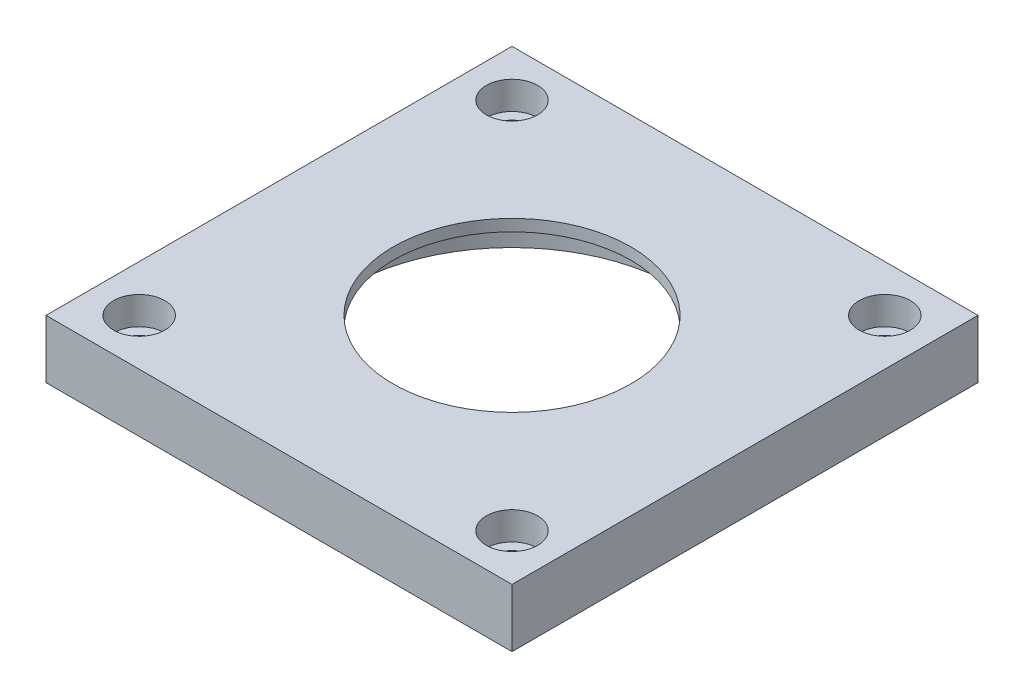
ISO-10303-21;
HEADER;
FILE_DESCRIPTION(('STEP AP214'),'2;1');
FILE_NAME('part.step','',(''),(''),'','','');
FILE_SCHEMA(('AUTOMOTIVE_DESIGN { 1 0 10303 214 1 1 1 1 }'));
ENDSEC;
DATA;
#1=APPLICATION_CONTEXT('core data for automotive mechanical design processes');
#2=APPLICATION_PROTOCOL_DEFINITION('international standard','automotive_design',2000,#1);
#3=PRODUCT_CONTEXT('',#1,'mechanical');
#4=PRODUCT('Part','Part','',(#3));
#5=PRODUCT_RELATED_PRODUCT_CATEGORY('part','',(#4));
#6=PRODUCT_DEFINITION_FORMATION('','',#4);
#7=PRODUCT_DEFINITION_CONTEXT('part definition',#1,'design');
#8=PRODUCT_DEFINITION('design','',#6,#7);
#9=PRODUCT_DEFINITION_SHAPE('','',#8);
#10=(LENGTH_UNIT() NAMED_UNIT(*) SI_UNIT(.MILLI.,.METRE.));
#11=(NAMED_UNIT(*) PLANE_ANGLE_UNIT() SI_UNIT($,.RADIAN.));
#12=(NAMED_UNIT(*) SI_UNIT($,.STERADIAN.) SOLID_ANGLE_UNIT());
#13=UNCERTAINTY_MEASURE_WITH_UNIT(LENGTH_MEASURE(1.E-05),#10,'distance_accuracy_value','');
#14=(GEOMETRIC_REPRESENTATION_CONTEXT(3) GLOBAL_UNCERTAINTY_ASSIGNED_CONTEXT((#13)) GLOBAL_UNIT_ASSIGNED_CONTEXT((#10,
#11,#12)) REPRESENTATION_CONTEXT('',''));
#15=CARTESIAN_POINT('',(0.,0.,0.));
#16=DIRECTION('',(0.,0.,1.));
#17=DIRECTION('',(1.,0.,0.));
#18=AXIS2_PLACEMENT_3D('',#15,#16,#17);
#19=CARTESIAN_POINT('',(-40.,12.5,40.));
#20=DIRECTION('',(0.,-1.,0.));
#21=DIRECTION('',(0.,0.,-1.));
#22=AXIS2_PLACEMENT_3D('',#19,#20,#21);
#23=CYLINDRICAL_SURFACE('',#22,3.25);
#24=CARTESIAN_POINT('',(-40.,0.,40.));
#25=DIRECTION('',(0.,-1.,0.));
#26=DIRECTION('',(0.,0.,-1.));
#27=AXIS2_PLACEMENT_3D('',#24,#25,#26);
#28=CIRCLE('',#27,3.25);
#29=CARTESIAN_POINT('',(-40.,0.,36.75));
#30=VERTEX_POINT('',#29);
#31=EDGE_CURVE('E139',#30,#30,#28,.T.);
#32=ORIENTED_EDGE('',*,*,#31,.T.);
#33=EDGE_LOOP('',(#32));
#34=FACE_BOUND('',#33,.T.);
#35=CARTESIAN_POINT('',(-40.,6.5,40.));
#36=DIRECTION('',(0.,1.,0.));
#37=DIRECTION('',(0.,0.,1.));
#38=AXIS2_PLACEMENT_3D('',#35,#36,#37);
#39=CIRCLE('',#38,3.25);
#40=CARTESIAN_POINT('',(-40.,6.5,43.25));
#41=VERTEX_POINT('',#40);
#42=EDGE_CURVE('E40',#41,#41,#39,.F.);
#43=ORIENTED_EDGE('',*,*,#42,.F.);
#44=EDGE_LOOP('',(#43));
#45=FACE_BOUND('',#44,.T.);
#46=ADVANCED_FACE('F36',(#34,#45),#23,.F.);
#47=CARTESIAN_POINT('',(39.9999999999996,12.5,40.0000000000004));
#48=DIRECTION('',(0.,-1.,0.));
#49=DIRECTION('',(0.,0.,-1.));
#50=AXIS2_PLACEMENT_3D('',#47,#48,#49);
#51=CYLINDRICAL_SURFACE('',#50,3.25);
#52=CARTESIAN_POINT('',(39.9999999999996,0.,40.0000000000004));
#53=DIRECTION('',(0.,-1.,0.));
#54=DIRECTION('',(-1.,0.,0.));
#55=AXIS2_PLACEMENT_3D('',#52,#53,#54);
#56=CIRCLE('',#55,3.25);
#57=CARTESIAN_POINT('',(36.7499999999996,0.,40.0000000000004));
#58=VERTEX_POINT('',#57);
#59=EDGE_CURVE('E115',#58,#58,#56,.T.);
#60=ORIENTED_EDGE('',*,*,#59,.T.);
#61=EDGE_LOOP('',(#60));
#62=FACE_BOUND('',#61,.T.);
#63=CARTESIAN_POINT('',(39.9999999999996,6.5,40.0000000000004));
#64=DIRECTION('',(0.,1.,0.));
#65=DIRECTION('',(0.,0.,1.));
#66=AXIS2_PLACEMENT_3D('',#63,#64,#65);
#67=CIRCLE('',#66,3.25);
#68=CARTESIAN_POINT('',(39.9999999999996,6.5,43.2500000000004));
#69=VERTEX_POINT('',#68);
#70=EDGE_CURVE('E119',#69,#69,#67,.F.);
#71=ORIENTED_EDGE('',*,*,#70,.F.);
#72=EDGE_LOOP('',(#71));
#73=FACE_BOUND('',#72,.T.);
#74=ADVANCED_FACE('F179',(#62,#73),#51,.F.);
#75=CARTESIAN_POINT('',(40.,12.5,-40.));
#76=DIRECTION('',(0.,-1.,0.));
#77=DIRECTION('',(0.,0.,-1.));
#78=AXIS2_PLACEMENT_3D('',#75,#76,#77);
#79=CYLINDRICAL_SURFACE('',#78,3.25);
#80=CARTESIAN_POINT('',(40.,0.,-40.));
#81=DIRECTION('',(0.,-1.,0.));
#82=DIRECTION('',(0.,0.,1.));
#83=AXIS2_PLACEMENT_3D('',#80,#81,#82);
#84=CIRCLE('',#83,3.25);
#85=CARTESIAN_POINT('',(40.,0.,-36.75));
#86=VERTEX_POINT('',#85);
#87=EDGE_CURVE('E140',#86,#86,#84,.T.);
#88=ORIENTED_EDGE('',*,*,#87,.T.);
#89=EDGE_LOOP('',(#88));
#90=FACE_BOUND('',#89,.T.);
#91=CARTESIAN_POINT('',(40.,6.5,-40.));
#92=DIRECTION('',(0.,1.,0.));
#93=DIRECTION('',(0.,0.,1.));
#94=AXIS2_PLACEMENT_3D('',#91,#92,#93);
#95=CIRCLE('',#94,3.25);
#96=CARTESIAN_POINT('',(40.,6.5,-36.75));
#97=VERTEX_POINT('',#96);
#98=EDGE_CURVE('E117',#97,#97,#95,.F.);
#99=ORIENTED_EDGE('',*,*,#98,.F.);
#100=EDGE_LOOP('',(#99));
#101=FACE_BOUND('',#100,.T.);
#102=ADVANCED_FACE('F185',(#90,#101),#79,.F.);
#103=CARTESIAN_POINT('',(-39.9999999999999,12.5,-40.0000000000001));
#104=DIRECTION('',(0.,-1.,0.));
#105=DIRECTION('',(0.,0.,-1.));
#106=AXIS2_PLACEMENT_3D('',#103,#104,#105);
#107=CYLINDRICAL_SURFACE('',#106,3.25);
#108=CARTESIAN_POINT('',(-39.9999999999999,0.,-40.0000000000001));
#109=DIRECTION('',(0.,-1.,0.));
#110=DIRECTION('',(1.,0.,0.));
#111=AXIS2_PLACEMENT_3D('',#108,#109,#110);
#112=CIRCLE('',#111,3.25);
#113=CARTESIAN_POINT('',(-36.7499999999999,0.,-40.0000000000001));
#114=VERTEX_POINT('',#113);
#115=EDGE_CURVE('E136',#114,#114,#112,.T.);
#116=ORIENTED_EDGE('',*,*,#115,.T.);
#117=EDGE_LOOP('',(#116));
#118=FACE_BOUND('',#117,.T.);
#119=CARTESIAN_POINT('',(-39.9999999999999,6.5,-40.0000000000001));
#120=DIRECTION('',(0.,1.,0.));
#121=DIRECTION('',(0.,0.,1.));
#122=AXIS2_PLACEMENT_3D('',#119,#120,#121);
#123=CIRCLE('',#122,3.25);
#124=CARTESIAN_POINT('',(-39.9999999999999,6.5,-36.7500000000001));
#125=VERTEX_POINT('',#124);
#126=EDGE_CURVE('E112',#125,#125,#123,.F.);
#127=ORIENTED_EDGE('',*,*,#126,.F.);
#128=EDGE_LOOP('',(#127));
#129=FACE_BOUND('',#128,.T.);
#130=ADVANCED_FACE('F323',(#118,#129),#107,.F.);
#131=CARTESIAN_POINT('',(50.,12.5,-50.));
#132=DIRECTION('',(-1.,0.,0.));
#133=DIRECTION('',(0.,0.,1.));
#134=AXIS2_PLACEMENT_3D('',#131,#132,#133);
#135=PLANE('',#134);
#136=DIRECTION('',(0.,0.,-1.));
#137=VECTOR('',#136,1.);
#138=CARTESIAN_POINT('',(50.,0.,-50.));
#139=LINE('',#138,#137);
#140=CARTESIAN_POINT('',(50.,0.,50.));
#141=VERTEX_POINT('',#140);
#142=CARTESIAN_POINT('',(50.,0.,-50.));
#143=VERTEX_POINT('',#142);
#144=EDGE_CURVE('E103',#141,#143,#139,.T.);
#145=ORIENTED_EDGE('',*,*,#144,.T.);
#146=DIRECTION('',(0.,-1.,0.));
#147=VECTOR('',#146,1.);
#148=CARTESIAN_POINT('',(50.,12.5,-50.));
#149=LINE('',#148,#147);
#150=CARTESIAN_POINT('',(50.,12.5,-50.));
#151=VERTEX_POINT('',#150);
#152=EDGE_CURVE('E11',#151,#143,#149,.T.);
#153=ORIENTED_EDGE('',*,*,#152,.F.);
#154=DIRECTION('',(0.,0.,-1.));
#155=VECTOR('',#154,1.);
#156=CARTESIAN_POINT('',(50.,12.5,-50.));
#157=LINE('',#156,#155);
#158=CARTESIAN_POINT('',(50.,12.5,50.));
#159=VERTEX_POINT('',#158);
#160=EDGE_CURVE('E90',#159,#151,#157,.T.);
#161=ORIENTED_EDGE('',*,*,#160,.F.);
#162=DIRECTION('',(0.,-1.,0.));
#163=VECTOR('',#162,1.);
#164=CARTESIAN_POINT('',(50.,12.5,50.));
#165=LINE('',#164,#163);
#166=EDGE_CURVE('E99',#159,#141,#165,.T.);
#167=ORIENTED_EDGE('',*,*,#166,.T.);
#168=EDGE_LOOP('',(#145,#153,#161,#167));
#169=FACE_BOUND('',#168,.T.);
#170=ADVANCED_FACE('F38',(#169),#135,.F.);
#171=CARTESIAN_POINT('',(-50.,12.5,-50.));
#172=DIRECTION('',(0.,0.,1.));
#173=DIRECTION('',(1.,0.,0.));
#174=AXIS2_PLACEMENT_3D('',#171,#172,#173);
#175=PLANE('',#174);
#176=DIRECTION('',(-1.,0.,0.));
#177=VECTOR('',#176,1.);
#178=CARTESIAN_POINT('',(-50.,0.,-50.));
#179=LINE('',#178,#177);
#180=CARTESIAN_POINT('',(-50.,0.,-50.));
#181=VERTEX_POINT('',#180);
#182=EDGE_CURVE('E94',#143,#181,#179,.T.);
#183=ORIENTED_EDGE('',*,*,#182,.T.);
#184=DIRECTION('',(0.,-1.,0.));
#185=VECTOR('',#184,1.);
#186=CARTESIAN_POINT('',(-50.,12.5,-50.));
#187=LINE('',#186,#185);
#188=CARTESIAN_POINT('',(-50.,12.5,-50.));
#189=VERTEX_POINT('',#188);
#190=EDGE_CURVE('E46',#189,#181,#187,.T.);
#191=ORIENTED_EDGE('',*,*,#190,.F.);
#192=DIRECTION('',(-1.,0.,0.));
#193=VECTOR('',#192,1.);
#194=CARTESIAN_POINT('',(-50.,12.5,-50.));
#195=LINE('',#194,#193);
#196=EDGE_CURVE('E85',#151,#189,#195,.T.);
#197=ORIENTED_EDGE('',*,*,#196,.F.);
#198=ORIENTED_EDGE('',*,*,#152,.T.);
#199=EDGE_LOOP('',(#183,#191,#197,#198));
#200=FACE_BOUND('',#199,.T.);
#201=ADVANCED_FACE('F93',(#200),#175,.F.);
#202=CARTESIAN_POINT('',(-50.,12.5,-50.));
#203=DIRECTION('',(1.,0.,0.));
#204=DIRECTION('',(0.,0.,-1.));
#205=AXIS2_PLACEMENT_3D('',#202,#203,#204);
#206=PLANE('',#205);
#207=DIRECTION('',(0.,0.,1.));
#208=VECTOR('',#207,1.);
#209=CARTESIAN_POINT('',(-50.,0.,-50.));
#210=LINE('',#209,#208);
#211=CARTESIAN_POINT('',(-50.,0.,50.));
#212=VERTEX_POINT('',#211);
#213=EDGE_CURVE('E72',#181,#212,#210,.T.);
#214=ORIENTED_EDGE('',*,*,#213,.T.);
#215=DIRECTION('',(0.,-1.,0.));
#216=VECTOR('',#215,1.);
#217=CARTESIAN_POINT('',(-50.,12.5,50.));
#218=LINE('',#217,#216);
#219=CARTESIAN_POINT('',(-50.,12.5,50.));
#220=VERTEX_POINT('',#219);
#221=EDGE_CURVE('E95',#220,#212,#218,.T.);
#222=ORIENTED_EDGE('',*,*,#221,.F.);
#223=DIRECTION('',(0.,0.,1.));
#224=VECTOR('',#223,1.);
#225=CARTESIAN_POINT('',(-50.,12.5,-50.));
#226=LINE('',#225,#224);
#227=EDGE_CURVE('E88',#189,#220,#226,.T.);
#228=ORIENTED_EDGE('',*,*,#227,.F.);
#229=ORIENTED_EDGE('',*,*,#190,.T.);
#230=EDGE_LOOP('',(#214,#222,#228,#229));
#231=FACE_BOUND('',#230,.T.);
#232=ADVANCED_FACE('F97',(#231),#206,.F.);
#233=CARTESIAN_POINT('',(-50.,12.5,50.));
#234=DIRECTION('',(0.,0.,-1.));
#235=DIRECTION('',(-1.,0.,0.));
#236=AXIS2_PLACEMENT_3D('',#233,#234,#235);
#237=PLANE('',#236);
#238=DIRECTION('',(1.,0.,0.));
#239=VECTOR('',#238,1.);
#240=CARTESIAN_POINT('',(-50.,0.,50.));
#241=LINE('',#240,#239);
#242=EDGE_CURVE('E78',#212,#141,#241,.T.);
#243=ORIENTED_EDGE('',*,*,#242,.T.);
#244=ORIENTED_EDGE('',*,*,#166,.F.);
#245=DIRECTION('',(1.,0.,0.));
#246=VECTOR('',#245,1.);
#247=CARTESIAN_POINT('',(-50.,12.5,50.));
#248=LINE('',#247,#246);
#249=EDGE_CURVE('E55',#220,#159,#248,.T.);
#250=ORIENTED_EDGE('',*,*,#249,.F.);
#251=ORIENTED_EDGE('',*,*,#221,.T.);
#252=EDGE_LOOP('',(#243,#244,#250,#251));
#253=FACE_BOUND('',#252,.T.);
#254=ADVANCED_FACE('F168',(#253),#237,.F.);
#255=CARTESIAN_POINT('',(0.,12.5,0.));
#256=DIRECTION('',(0.,1.,0.));
#257=DIRECTION('',(0.,0.,1.));
#258=AXIS2_PLACEMENT_3D('',#255,#256,#257);
#259=PLANE('',#258);
#260=CARTESIAN_POINT('',(40.0000000000003,12.5,-39.9999999999997));
#261=DIRECTION('',(0.,1.,0.));
#262=DIRECTION('',(-1.,0.,0.));
#263=AXIS2_PLACEMENT_3D('',#260,#261,#262);
#264=CIRCLE('',#263,5.5);
#265=CARTESIAN_POINT('',(34.5000000000003,12.5,-39.9999999999997));
#266=VERTEX_POINT('',#265);
#267=EDGE_CURVE('E437',#266,#266,#264,.T.);
#268=ORIENTED_EDGE('',*,*,#267,.F.);
#269=EDGE_LOOP('',(#268));
#270=FACE_BOUND('',#269,.T.);
#271=CARTESIAN_POINT('',(39.9999999999999,12.5,40.0000000000001));
#272=DIRECTION('',(0.,1.,0.));
#273=DIRECTION('',(0.,0.,-1.));
#274=AXIS2_PLACEMENT_3D('',#271,#272,#273);
#275=CIRCLE('',#274,5.5);
#276=CARTESIAN_POINT('',(39.9999999999999,12.5,34.5000000000001));
#277=VERTEX_POINT('',#276);
#278=EDGE_CURVE('E429',#277,#277,#275,.T.);
#279=ORIENTED_EDGE('',*,*,#278,.F.);
#280=EDGE_LOOP('',(#279));
#281=FACE_BOUND('',#280,.T.);
#282=CARTESIAN_POINT('',(-40.0000000000006,12.5,39.9999999999994));
#283=DIRECTION('',(0.,1.,0.));
#284=DIRECTION('',(1.,0.,0.));
#285=AXIS2_PLACEMENT_3D('',#282,#283,#284);
#286=CIRCLE('',#285,5.5);
#287=CARTESIAN_POINT('',(-34.5000000000006,12.5,39.9999999999995));
#288=VERTEX_POINT('',#287);
#289=EDGE_CURVE('E427',#288,#288,#286,.T.);
#290=ORIENTED_EDGE('',*,*,#289,.F.);
#291=EDGE_LOOP('',(#290));
#292=FACE_BOUND('',#291,.T.);
#293=CARTESIAN_POINT('',(-39.9999999999999,12.5,-40.0000000000001));
#294=DIRECTION('',(0.,1.,0.));
#295=DIRECTION('',(0.,0.,1.));
#296=AXIS2_PLACEMENT_3D('',#293,#294,#295);
#297=CIRCLE('',#296,5.5);
#298=CARTESIAN_POINT('',(-39.9999999999999,12.5,-34.5000000000001));
#299=VERTEX_POINT('',#298);
#300=EDGE_CURVE('E125',#299,#299,#297,.T.);
#301=ORIENTED_EDGE('',*,*,#300,.F.);
#302=EDGE_LOOP('',(#301));
#303=FACE_BOUND('',#302,.T.);
#304=CARTESIAN_POINT('',(0.,12.5,0.));
#305=DIRECTION('',(0.,-1.,0.));
#306=DIRECTION('',(0.,0.,-1.));
#307=AXIS2_PLACEMENT_3D('',#304,#305,#306);
#308=CIRCLE('',#307,25.5);
#309=CARTESIAN_POINT('',(0.,12.5,-25.5));
#310=VERTEX_POINT('',#309);
#311=EDGE_CURVE('E148',#310,#310,#308,.T.);
#312=ORIENTED_EDGE('',*,*,#311,.T.);
#313=EDGE_LOOP('',(#312));
#314=FACE_BOUND('',#313,.T.);
#315=ORIENTED_EDGE('',*,*,#160,.T.);
#316=ORIENTED_EDGE('',*,*,#196,.T.);
#317=ORIENTED_EDGE('',*,*,#227,.T.);
#318=ORIENTED_EDGE('',*,*,#249,.T.);
#319=EDGE_LOOP('',(#315,#316,#317,#318));
#320=FACE_BOUND('',#319,.T.);
#321=ADVANCED_FACE('F86',(#270,#281,#292,#303,#314,#320),#259,.T.);
#322=CARTESIAN_POINT('',(0.,0.,0.));
#323=DIRECTION('',(0.,1.,0.));
#324=DIRECTION('',(0.,0.,1.));
#325=AXIS2_PLACEMENT_3D('',#322,#323,#324);
#326=PLANE('',#325);
#327=ORIENTED_EDGE('',*,*,#115,.F.);
#328=EDGE_LOOP('',(#327));
#329=FACE_BOUND('',#328,.T.);
#330=ORIENTED_EDGE('',*,*,#87,.F.);
#331=EDGE_LOOP('',(#330));
#332=FACE_BOUND('',#331,.T.);
#333=ORIENTED_EDGE('',*,*,#59,.F.);
#334=EDGE_LOOP('',(#333));
#335=FACE_BOUND('',#334,.T.);
#336=ORIENTED_EDGE('',*,*,#31,.F.);
#337=EDGE_LOOP('',(#336));
#338=FACE_BOUND('',#337,.T.);
#339=CARTESIAN_POINT('',(0.,0.,0.));
#340=DIRECTION('',(0.,-1.,0.));
#341=DIRECTION('',(0.,0.,-1.));
#342=AXIS2_PLACEMENT_3D('',#339,#340,#341);
#343=CIRCLE('',#342,35.5);
#344=CARTESIAN_POINT('',(0.,0.,-35.5));
#345=VERTEX_POINT('',#344);
#346=EDGE_CURVE('E151',#345,#345,#343,.T.);
#347=ORIENTED_EDGE('',*,*,#346,.F.);
#348=EDGE_LOOP('',(#347));
#349=FACE_BOUND('',#348,.T.);
#350=ORIENTED_EDGE('',*,*,#144,.F.);
#351=ORIENTED_EDGE('',*,*,#242,.F.);
#352=ORIENTED_EDGE('',*,*,#213,.F.);
#353=ORIENTED_EDGE('',*,*,#182,.F.);
#354=EDGE_LOOP('',(#350,#351,#352,#353));
#355=FACE_BOUND('',#354,.T.);
#356=ADVANCED_FACE('F161',(#329,#332,#335,#338,#349,#355),#326,.F.);
#357=CARTESIAN_POINT('',(0.,10.,0.));
#358=DIRECTION('',(0.,-1.,0.));
#359=DIRECTION('',(0.,0.,-1.));
#360=AXIS2_PLACEMENT_3D('',#357,#358,#359);
#361=CYLINDRICAL_SURFACE('',#360,35.5);
#362=CARTESIAN_POINT('',(0.,10.,0.));
#363=DIRECTION('',(0.,-1.,0.));
#364=DIRECTION('',(0.,0.,-1.));
#365=AXIS2_PLACEMENT_3D('',#362,#363,#364);
#366=CIRCLE('',#365,35.5);
#367=CARTESIAN_POINT('',(0.,10.,-35.5));
#368=VERTEX_POINT('',#367);
#369=EDGE_CURVE('E106',#368,#368,#366,.T.);
#370=ORIENTED_EDGE('',*,*,#369,.F.);
#371=EDGE_LOOP('',(#370));
#372=FACE_BOUND('',#371,.T.);
#373=ORIENTED_EDGE('',*,*,#346,.T.);
#374=EDGE_LOOP('',(#373));
#375=FACE_BOUND('',#374,.T.);
#376=ADVANCED_FACE('F159',(#372,#375),#361,.F.);
#377=CARTESIAN_POINT('',(0.,10.,0.));
#378=DIRECTION('',(0.,-1.,0.));
#379=DIRECTION('',(0.,0.,-1.));
#380=AXIS2_PLACEMENT_3D('',#377,#378,#379);
#381=PLANE('',#380);
#382=CARTESIAN_POINT('',(0.,10.,0.));
#383=DIRECTION('',(0.,-1.,0.));
#384=DIRECTION('',(0.,0.,-1.));
#385=AXIS2_PLACEMENT_3D('',#382,#383,#384);
#386=CIRCLE('',#385,25.5);
#387=CARTESIAN_POINT('',(0.,10.,-25.5));
#388=VERTEX_POINT('',#387);
#389=EDGE_CURVE('E147',#388,#388,#386,.T.);
#390=ORIENTED_EDGE('',*,*,#389,.F.);
#391=EDGE_LOOP('',(#390));
#392=FACE_BOUND('',#391,.T.);
#393=ORIENTED_EDGE('',*,*,#369,.T.);
#394=EDGE_LOOP('',(#393));
#395=FACE_BOUND('',#394,.T.);
#396=ADVANCED_FACE('F195',(#392,#395),#381,.T.);
#397=CARTESIAN_POINT('',(0.,12.5,0.));
#398=DIRECTION('',(0.,-1.,0.));
#399=DIRECTION('',(0.,0.,-1.));
#400=AXIS2_PLACEMENT_3D('',#397,#398,#399);
#401=CYLINDRICAL_SURFACE('',#400,25.5);
#402=ORIENTED_EDGE('',*,*,#311,.F.);
#403=EDGE_LOOP('',(#402));
#404=FACE_BOUND('',#403,.T.);
#405=ORIENTED_EDGE('',*,*,#389,.T.);
#406=EDGE_LOOP('',(#405));
#407=FACE_BOUND('',#406,.T.);
#408=ADVANCED_FACE('F191',(#404,#407),#401,.F.);
#409=CARTESIAN_POINT('',(-39.9999999999999,6.5,-40.0000000000001));
#410=DIRECTION('',(0.,1.,0.));
#411=DIRECTION('',(0.,0.,1.));
#412=AXIS2_PLACEMENT_3D('',#409,#410,#411);
#413=PLANE('',#412);
#414=CARTESIAN_POINT('',(-39.9999999999999,6.5,-40.0000000000001));
#415=DIRECTION('',(0.,1.,0.));
#416=DIRECTION('',(0.,0.,1.));
#417=AXIS2_PLACEMENT_3D('',#414,#415,#416);
#418=CIRCLE('',#417,5.5);
#419=CARTESIAN_POINT('',(-39.9999999999999,6.5,-34.5000000000001));
#420=VERTEX_POINT('',#419);
#421=EDGE_CURVE('E116',#420,#420,#418,.T.);
#422=ORIENTED_EDGE('',*,*,#421,.T.);
#423=EDGE_LOOP('',(#422));
#424=FACE_BOUND('',#423,.T.);
#425=ORIENTED_EDGE('',*,*,#126,.T.);
#426=EDGE_LOOP('',(#425));
#427=FACE_BOUND('',#426,.T.);
#428=ADVANCED_FACE('F194',(#424,#427),#413,.T.);
#429=CARTESIAN_POINT('',(-39.9999999999999,6.5,-40.0000000000001));
#430=DIRECTION('',(0.,1.,0.));
#431=DIRECTION('',(0.,0.,1.));
#432=AXIS2_PLACEMENT_3D('',#429,#430,#431);
#433=CYLINDRICAL_SURFACE('',#432,5.5);
#434=ORIENTED_EDGE('',*,*,#421,.F.);
#435=EDGE_LOOP('',(#434));
#436=FACE_BOUND('',#435,.T.);
#437=ORIENTED_EDGE('',*,*,#300,.T.);
#438=EDGE_LOOP('',(#437));
#439=FACE_BOUND('',#438,.T.);
#440=ADVANCED_FACE('F222',(#436,#439),#433,.F.);
#441=CARTESIAN_POINT('',(40.0000000000003,6.5,-39.9999999999997));
#442=DIRECTION('',(0.,1.,0.));
#443=DIRECTION('',(-1.,0.,0.));
#444=AXIS2_PLACEMENT_3D('',#441,#442,#443);
#445=PLANE('',#444);
#446=CARTESIAN_POINT('',(40.0000000000003,6.5,-39.9999999999997));
#447=DIRECTION('',(0.,1.,0.));
#448=DIRECTION('',(-1.,0.,0.));
#449=AXIS2_PLACEMENT_3D('',#446,#447,#448);
#450=CIRCLE('',#449,5.5);
#451=CARTESIAN_POINT('',(34.5000000000003,6.5,-39.9999999999997));
#452=VERTEX_POINT('',#451);
#453=EDGE_CURVE('E120',#452,#452,#450,.T.);
#454=ORIENTED_EDGE('',*,*,#453,.T.);
#455=EDGE_LOOP('',(#454));
#456=FACE_BOUND('',#455,.T.);
#457=ORIENTED_EDGE('',*,*,#98,.T.);
#458=EDGE_LOOP('',(#457));
#459=FACE_BOUND('',#458,.T.);
#460=ADVANCED_FACE('F231',(#456,#459),#445,.T.);
#461=CARTESIAN_POINT('',(40.0000000000003,6.5,-39.9999999999997));
#462=DIRECTION('',(0.,1.,0.));
#463=DIRECTION('',(0.,0.,1.));
#464=AXIS2_PLACEMENT_3D('',#461,#462,#463);
#465=CYLINDRICAL_SURFACE('',#464,5.5);
#466=ORIENTED_EDGE('',*,*,#453,.F.);
#467=EDGE_LOOP('',(#466));
#468=FACE_BOUND('',#467,.T.);
#469=ORIENTED_EDGE('',*,*,#267,.T.);
#470=EDGE_LOOP('',(#469));
#471=FACE_BOUND('',#470,.T.);
#472=ADVANCED_FACE('F239',(#468,#471),#465,.F.);
#473=CARTESIAN_POINT('',(39.9999999999999,6.5,40.0000000000001));
#474=DIRECTION('',(0.,1.,0.));
#475=DIRECTION('',(0.,0.,-1.));
#476=AXIS2_PLACEMENT_3D('',#473,#474,#475);
#477=PLANE('',#476);
#478=CARTESIAN_POINT('',(39.9999999999999,6.5,40.0000000000001));
#479=DIRECTION('',(0.,1.,0.));
#480=DIRECTION('',(0.,0.,-1.));
#481=AXIS2_PLACEMENT_3D('',#478,#479,#480);
#482=CIRCLE('',#481,5.5);
#483=CARTESIAN_POINT('',(39.9999999999999,6.5,34.5000000000001));
#484=VERTEX_POINT('',#483);
#485=EDGE_CURVE('E434',#484,#484,#482,.T.);
#486=ORIENTED_EDGE('',*,*,#485,.T.);
#487=EDGE_LOOP('',(#486));
#488=FACE_BOUND('',#487,.T.);
#489=ORIENTED_EDGE('',*,*,#70,.T.);
#490=EDGE_LOOP('',(#489));
#491=FACE_BOUND('',#490,.T.);
#492=ADVANCED_FACE('F248',(#488,#491),#477,.T.);
#493=CARTESIAN_POINT('',(39.9999999999999,6.5,40.0000000000001));
#494=DIRECTION('',(0.,1.,0.));
#495=DIRECTION('',(0.,0.,1.));
#496=AXIS2_PLACEMENT_3D('',#493,#494,#495);
#497=CYLINDRICAL_SURFACE('',#496,5.5);
#498=ORIENTED_EDGE('',*,*,#485,.F.);
#499=EDGE_LOOP('',(#498));
#500=FACE_BOUND('',#499,.T.);
#501=ORIENTED_EDGE('',*,*,#278,.T.);
#502=EDGE_LOOP('',(#501));
#503=FACE_BOUND('',#502,.T.);
#504=ADVANCED_FACE('F256',(#500,#503),#497,.F.);
#505=CARTESIAN_POINT('',(-40.0000000000006,6.5,39.9999999999994));
#506=DIRECTION('',(0.,1.,0.));
#507=DIRECTION('',(1.,0.,0.));
#508=AXIS2_PLACEMENT_3D('',#505,#506,#507);
#509=PLANE('',#508);
#510=CARTESIAN_POINT('',(-40.0000000000006,6.5,39.9999999999994));
#511=DIRECTION('',(0.,1.,0.));
#512=DIRECTION('',(1.,0.,0.));
#513=AXIS2_PLACEMENT_3D('',#510,#511,#512);
#514=CIRCLE('',#513,5.5);
#515=CARTESIAN_POINT('',(-34.5000000000006,6.5,39.9999999999995));
#516=VERTEX_POINT('',#515);
#517=EDGE_CURVE('E424',#516,#516,#514,.T.);
#518=ORIENTED_EDGE('',*,*,#517,.T.);
#519=EDGE_LOOP('',(#518));
#520=FACE_BOUND('',#519,.T.);
#521=ORIENTED_EDGE('',*,*,#42,.T.);
#522=EDGE_LOOP('',(#521));
#523=FACE_BOUND('',#522,.T.);
#524=ADVANCED_FACE('F264',(#520,#523),#509,.T.);
#525=CARTESIAN_POINT('',(-40.0000000000006,6.5,39.9999999999994));
#526=DIRECTION('',(0.,1.,0.));
#527=DIRECTION('',(0.,0.,1.));
#528=AXIS2_PLACEMENT_3D('',#525,#526,#527);
#529=CYLINDRICAL_SURFACE('',#528,5.5);
#530=ORIENTED_EDGE('',*,*,#517,.F.);
#531=EDGE_LOOP('',(#530));
#532=FACE_BOUND('',#531,.T.);
#533=ORIENTED_EDGE('',*,*,#289,.T.);
#534=EDGE_LOOP('',(#533));
#535=FACE_BOUND('',#534,.T.);
#536=ADVANCED_FACE('F272',(#532,#535),#529,.F.);
#537=CLOSED_SHELL('',(#46,#74,#102,#130,#170,#201,#232,#254,#321,#356,#376,#396,#408,#428,#440,
#460,#472,#492,#504,#524,#536));
#538=MANIFOLD_SOLID_BREP('B2',#537);
#539=ADVANCED_BREP_SHAPE_REPRESENTATION('',(#18,#538),#14);
#540=SHAPE_DEFINITION_REPRESENTATION(#9,#539);
ENDSEC;
END-ISO-10303-21;
